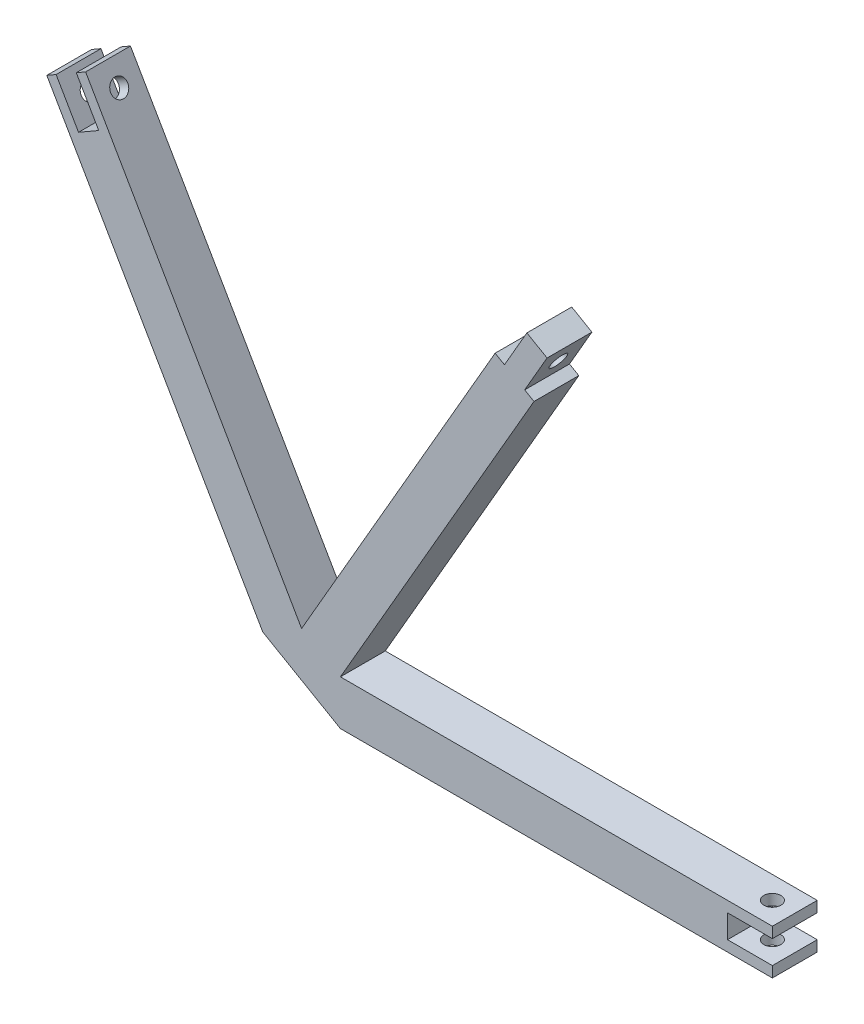
ISO-10303-21;
HEADER;
FILE_DESCRIPTION(('STEP AP214'),'2;1');
FILE_NAME('part.step','',(''),(''),'','','');
FILE_SCHEMA(('AUTOMOTIVE_DESIGN { 1 0 10303 214 1 1 1 1 }'));
ENDSEC;
DATA;
#1=APPLICATION_CONTEXT('core data for automotive mechanical design processes');
#2=APPLICATION_PROTOCOL_DEFINITION('international standard','automotive_design',2000,#1);
#3=PRODUCT_CONTEXT('',#1,'mechanical');
#4=PRODUCT('Part','Part','',(#3));
#5=PRODUCT_RELATED_PRODUCT_CATEGORY('part','',(#4));
#6=PRODUCT_DEFINITION_FORMATION('','',#4);
#7=PRODUCT_DEFINITION_CONTEXT('part definition',#1,'design');
#8=PRODUCT_DEFINITION('design','',#6,#7);
#9=PRODUCT_DEFINITION_SHAPE('','',#8);
#10=(LENGTH_UNIT() NAMED_UNIT(*) SI_UNIT(.MILLI.,.METRE.));
#11=(NAMED_UNIT(*) PLANE_ANGLE_UNIT() SI_UNIT($,.RADIAN.));
#12=(NAMED_UNIT(*) SI_UNIT($,.STERADIAN.) SOLID_ANGLE_UNIT());
#13=UNCERTAINTY_MEASURE_WITH_UNIT(LENGTH_MEASURE(1.E-05),#10,'distance_accuracy_value','');
#14=(GEOMETRIC_REPRESENTATION_CONTEXT(3) GLOBAL_UNCERTAINTY_ASSIGNED_CONTEXT((#13)) GLOBAL_UNIT_ASSIGNED_CONTEXT((#10,
#11,#12)) REPRESENTATION_CONTEXT('',''));
#15=CARTESIAN_POINT('',(0.,0.,0.));
#16=DIRECTION('',(0.,0.,1.));
#17=DIRECTION('',(1.,0.,0.));
#18=AXIS2_PLACEMENT_3D('',#15,#16,#17);
#19=CARTESIAN_POINT('',(-74.0849364905391,46.7163336986829,-2.5));
#20=DIRECTION('',(-0.500000000000004,0.866025403784436,0.));
#21=DIRECTION('',(0.,0.,-1.));
#22=AXIS2_PLACEMENT_3D('',#19,#20,#21);
#23=PLANE('',#22);
#24=DIRECTION('',(0.,0.,-1.));
#25=VECTOR('',#24,1.);
#26=CARTESIAN_POINT('',(-75.1241669750805,46.1163336986829,-2.5));
#27=LINE('',#26,#25);
#28=CARTESIAN_POINT('',(-75.1241669750805,46.1163336986829,2.5));
#29=VERTEX_POINT('',#28);
#30=CARTESIAN_POINT('',(-75.1241669750805,46.1163336986829,-2.5));
#31=VERTEX_POINT('',#30);
#32=EDGE_CURVE('E92',#29,#31,#27,.T.);
#33=ORIENTED_EDGE('',*,*,#32,.F.);
#34=DIRECTION('',(-0.866025403784436,-0.500000000000004,0.));
#35=VECTOR('',#34,1.);
#36=CARTESIAN_POINT('',(-74.0849364905391,46.7163336986829,2.5));
#37=LINE('',#36,#35);
#38=CARTESIAN_POINT('',(-74.0849364905391,46.7163336986829,2.5));
#39=VERTEX_POINT('',#38);
#40=EDGE_CURVE('E12',#39,#29,#37,.T.);
#41=ORIENTED_EDGE('',*,*,#40,.F.);
#42=DIRECTION('',(0.,0.,-1.));
#43=VECTOR('',#42,1.);
#44=CARTESIAN_POINT('',(-74.0849364905391,46.7163336986829,-2.5));
#45=LINE('',#44,#43);
#46=CARTESIAN_POINT('',(-74.0849364905391,46.7163336986829,-2.5));
#47=VERTEX_POINT('',#46);
#48=EDGE_CURVE('E103',#39,#47,#45,.T.);
#49=ORIENTED_EDGE('',*,*,#48,.T.);
#50=DIRECTION('',(-0.866025403784436,-0.500000000000004,0.));
#51=VECTOR('',#50,1.);
#52=CARTESIAN_POINT('',(-74.0849364905391,46.7163336986829,-2.5));
#53=LINE('',#52,#51);
#54=EDGE_CURVE('E53',#47,#31,#53,.T.);
#55=ORIENTED_EDGE('',*,*,#54,.T.);
#56=EDGE_LOOP('',(#33,#41,#49,#55));
#57=FACE_BOUND('',#56,.T.);
#58=ADVANCED_FACE('F50',(#57),#23,.T.);
#59=CARTESIAN_POINT('',(-71.5849364905391,42.3862066797607,2.5));
#60=DIRECTION('',(0.,0.,1.));
#61=DIRECTION('',(-0.500000000000004,0.866025403784436,0.));
#62=AXIS2_PLACEMENT_3D('',#59,#60,#61);
#63=PLANE('',#62);
#64=DIRECTION('',(-0.500000000000004,0.866025403784436,0.));
#65=VECTOR('',#64,1.);
#66=CARTESIAN_POINT('',(-72.6241669750804,41.7862066797607,2.5));
#67=LINE('',#66,#65);
#68=CARTESIAN_POINT('',(-72.6241669750804,41.7862066797607,2.5));
#69=VERTEX_POINT('',#68);
#70=EDGE_CURVE('E87',#69,#29,#67,.T.);
#71=ORIENTED_EDGE('',*,*,#70,.F.);
#72=DIRECTION('',(-0.866025403784436,-0.500000000000004,0.));
#73=VECTOR('',#72,1.);
#74=CARTESIAN_POINT('',(-75.9150635094613,39.8862066797607,2.5));
#75=LINE('',#74,#73);
#76=CARTESIAN_POINT('',(-74.87583302492,40.4862066797607,2.5));
#77=VERTEX_POINT('',#76);
#78=EDGE_CURVE('E80',#69,#77,#75,.T.);
#79=ORIENTED_EDGE('',*,*,#78,.T.);
#80=DIRECTION('',(-0.500000000000004,0.866025403784436,0.));
#81=VECTOR('',#80,1.);
#82=CARTESIAN_POINT('',(-74.87583302492,40.4862066797607,2.5));
#83=LINE('',#82,#81);
#84=CARTESIAN_POINT('',(-77.37583302492,44.8163336986829,2.5));
#85=VERTEX_POINT('',#84);
#86=EDGE_CURVE('E134',#77,#85,#83,.T.);
#87=ORIENTED_EDGE('',*,*,#86,.T.);
#88=DIRECTION('',(0.866025403784436,0.500000000000004,0.));
#89=VECTOR('',#88,1.);
#90=CARTESIAN_POINT('',(-78.4150635094613,44.2163336986829,2.5));
#91=LINE('',#90,#89);
#92=CARTESIAN_POINT('',(-78.4150635094613,44.2163336986829,2.5));
#93=VERTEX_POINT('',#92);
#94=EDGE_CURVE('E129',#93,#85,#91,.T.);
#95=ORIENTED_EDGE('',*,*,#94,.F.);
#96=DIRECTION('',(-0.500000000000004,0.866025403784436,0.));
#97=VECTOR('',#96,1.);
#98=CARTESIAN_POINT('',(-75.9150635094613,39.8862066797607,2.5));
#99=LINE('',#98,#97);
#100=CARTESIAN_POINT('',(-54.3301270189222,2.49999999999998,2.5));
#101=VERTEX_POINT('',#100);
#102=EDGE_CURVE('E133',#101,#93,#99,.T.);
#103=ORIENTED_EDGE('',*,*,#102,.F.);
#104=DIRECTION('',(0.866025403784442,-0.499999999999995,0.));
#105=VECTOR('',#104,1.);
#106=CARTESIAN_POINT('',(-87.5000000000001,21.6506350946107,2.5));
#107=LINE('',#106,#105);
#108=CARTESIAN_POINT('',(-45.6698729810778,-2.5,2.5));
#109=VERTEX_POINT('',#108);
#110=EDGE_CURVE('E178',#101,#109,#107,.T.);
#111=ORIENTED_EDGE('',*,*,#110,.T.);
#112=DIRECTION('',(1.,0.,0.));
#113=VECTOR('',#112,1.);
#114=CARTESIAN_POINT('',(-2.5,-2.5,2.5));
#115=LINE('',#114,#113);
#116=CARTESIAN_POINT('',(2.5,-2.5,2.5));
#117=VERTEX_POINT('',#116);
#118=EDGE_CURVE('E281',#109,#117,#115,.T.);
#119=ORIENTED_EDGE('',*,*,#118,.T.);
#120=DIRECTION('',(0.,1.,0.));
#121=VECTOR('',#120,1.);
#122=CARTESIAN_POINT('',(2.5,-2.5,2.5));
#123=LINE('',#122,#121);
#124=CARTESIAN_POINT('',(2.5,-1.3,2.5));
#125=VERTEX_POINT('',#124);
#126=EDGE_CURVE('E276',#117,#125,#123,.T.);
#127=ORIENTED_EDGE('',*,*,#126,.T.);
#128=DIRECTION('',(1.,0.,0.));
#129=VECTOR('',#128,1.);
#130=CARTESIAN_POINT('',(-2.5,-1.3,2.5));
#131=LINE('',#130,#129);
#132=CARTESIAN_POINT('',(-2.5,-1.3,2.5));
#133=VERTEX_POINT('',#132);
#134=EDGE_CURVE('E285',#133,#125,#131,.T.);
#135=ORIENTED_EDGE('',*,*,#134,.F.);
#136=DIRECTION('',(0.,1.,0.));
#137=VECTOR('',#136,1.);
#138=CARTESIAN_POINT('',(-2.5,2.5,2.5));
#139=LINE('',#138,#137);
#140=CARTESIAN_POINT('',(-2.5,1.3,2.5));
#141=VERTEX_POINT('',#140);
#142=EDGE_CURVE('E361',#133,#141,#139,.T.);
#143=ORIENTED_EDGE('',*,*,#142,.T.);
#144=DIRECTION('',(1.,0.,0.));
#145=VECTOR('',#144,1.);
#146=CARTESIAN_POINT('',(-2.5,1.3,2.5));
#147=LINE('',#146,#145);
#148=CARTESIAN_POINT('',(2.5,1.3,2.5));
#149=VERTEX_POINT('',#148);
#150=EDGE_CURVE('E329',#141,#149,#147,.T.);
#151=ORIENTED_EDGE('',*,*,#150,.T.);
#152=DIRECTION('',(0.,-1.,0.));
#153=VECTOR('',#152,1.);
#154=CARTESIAN_POINT('',(2.5,2.5,2.5));
#155=LINE('',#154,#153);
#156=CARTESIAN_POINT('',(2.5,2.5,2.5));
#157=VERTEX_POINT('',#156);
#158=EDGE_CURVE('E324',#157,#149,#155,.T.);
#159=ORIENTED_EDGE('',*,*,#158,.F.);
#160=DIRECTION('',(1.,0.,0.));
#161=VECTOR('',#160,1.);
#162=CARTESIAN_POINT('',(-2.5,2.5,2.5));
#163=LINE('',#162,#161);
#164=CARTESIAN_POINT('',(-45.6698729810778,2.5,2.5));
#165=VERTEX_POINT('',#164);
#166=EDGE_CURVE('E328',#165,#157,#163,.T.);
#167=ORIENTED_EDGE('',*,*,#166,.F.);
#168=DIRECTION('',(0.499999999999998,0.86602540378444,0.));
#169=VECTOR('',#168,1.);
#170=CARTESIAN_POINT('',(-47.8349364905389,-1.24999999999999,2.5));
#171=LINE('',#170,#169);
#172=CARTESIAN_POINT('',(-24.084936490539,39.8862066797609,2.5));
#173=VERTEX_POINT('',#172);
#174=EDGE_CURVE('E242',#165,#173,#171,.T.);
#175=ORIENTED_EDGE('',*,*,#174,.T.);
#176=DIRECTION('',(-0.86602540378444,0.499999999999998,0.));
#177=VECTOR('',#176,1.);
#178=CARTESIAN_POINT('',(-28.4150635094612,42.3862066797609,2.5));
#179=LINE('',#178,#177);
#180=CARTESIAN_POINT('',(-25.1241669750803,40.4862066797609,2.5));
#181=VERTEX_POINT('',#180);
#182=EDGE_CURVE('E258',#173,#181,#179,.T.);
#183=ORIENTED_EDGE('',*,*,#182,.T.);
#184=DIRECTION('',(0.499999999999998,0.86602540378444,0.));
#185=VECTOR('',#184,1.);
#186=CARTESIAN_POINT('',(-25.1241669750803,40.4862066797609,2.5));
#187=LINE('',#186,#185);
#188=CARTESIAN_POINT('',(-22.6241669750803,44.8163336986831,2.5));
#189=VERTEX_POINT('',#188);
#190=EDGE_CURVE('E199',#181,#189,#187,.T.);
#191=ORIENTED_EDGE('',*,*,#190,.T.);
#192=DIRECTION('',(0.86602540378444,-0.499999999999998,0.));
#193=VECTOR('',#192,1.);
#194=CARTESIAN_POINT('',(-24.8758330249199,46.1163336986831,2.5));
#195=LINE('',#194,#193);
#196=CARTESIAN_POINT('',(-24.8758330249199,46.1163336986831,2.5));
#197=VERTEX_POINT('',#196);
#198=EDGE_CURVE('E194',#197,#189,#195,.T.);
#199=ORIENTED_EDGE('',*,*,#198,.F.);
#200=DIRECTION('',(0.499999999999998,0.86602540378444,0.));
#201=VECTOR('',#200,1.);
#202=CARTESIAN_POINT('',(-27.3758330249199,41.7862066797609,2.5));
#203=LINE('',#202,#201);
#204=CARTESIAN_POINT('',(-27.3758330249199,41.7862066797609,2.5));
#205=VERTEX_POINT('',#204);
#206=EDGE_CURVE('E198',#205,#197,#203,.T.);
#207=ORIENTED_EDGE('',*,*,#206,.F.);
#208=CARTESIAN_POINT('',(-28.4150635094612,42.3862066797609,2.5));
#209=VERTEX_POINT('',#208);
#210=EDGE_CURVE('E262',#205,#209,#179,.T.);
#211=ORIENTED_EDGE('',*,*,#210,.T.);
#212=DIRECTION('',(0.499999999999998,0.86602540378444,0.));
#213=VECTOR('',#212,1.);
#214=CARTESIAN_POINT('',(-52.1650635094611,1.24999999999999,2.5));
#215=LINE('',#214,#213);
#216=CARTESIAN_POINT('',(-50.,5.,2.5));
#217=VERTEX_POINT('',#216);
#218=EDGE_CURVE('E246',#217,#209,#215,.T.);
#219=ORIENTED_EDGE('',*,*,#218,.F.);
#220=DIRECTION('',(-0.500000000000004,0.866025403784436,0.));
#221=VECTOR('',#220,1.);
#222=CARTESIAN_POINT('',(-71.5849364905391,42.3862066797607,2.5));
#223=LINE('',#222,#221);
#224=EDGE_CURVE('E90',#217,#39,#223,.T.);
#225=ORIENTED_EDGE('',*,*,#224,.T.);
#226=ORIENTED_EDGE('',*,*,#40,.T.);
#227=EDGE_LOOP('',(#71,#79,#87,#95,#103,#111,#119,#127,#135,#143,#151,#159,#167,#175,#183,#191,
#199,#207,#211,#219,#225,#226));
#228=FACE_BOUND('',#227,.T.);
#229=ADVANCED_FACE('F85',(#228),#63,.T.);
#230=CARTESIAN_POINT('',(-71.5849364905391,42.3862066797607,-2.5));
#231=DIRECTION('',(0.,0.,-1.));
#232=DIRECTION('',(0.500000000000004,-0.866025403784436,0.));
#233=AXIS2_PLACEMENT_3D('',#230,#231,#232);
#234=PLANE('',#233);
#235=DIRECTION('',(0.500000000000004,-0.866025403784436,0.));
#236=VECTOR('',#235,1.);
#237=CARTESIAN_POINT('',(-72.6241669750804,41.7862066797607,-2.5));
#238=LINE('',#237,#236);
#239=CARTESIAN_POINT('',(-72.6241669750804,41.7862066797607,-2.5));
#240=VERTEX_POINT('',#239);
#241=EDGE_CURVE('E97',#31,#240,#238,.T.);
#242=ORIENTED_EDGE('',*,*,#241,.F.);
#243=ORIENTED_EDGE('',*,*,#54,.F.);
#244=DIRECTION('',(0.500000000000004,-0.866025403784436,0.));
#245=VECTOR('',#244,1.);
#246=CARTESIAN_POINT('',(-71.5849364905391,42.3862066797607,-2.5));
#247=LINE('',#246,#245);
#248=CARTESIAN_POINT('',(-50.,5.,-2.5));
#249=VERTEX_POINT('',#248);
#250=EDGE_CURVE('E107',#47,#249,#247,.T.);
#251=ORIENTED_EDGE('',*,*,#250,.T.);
#252=DIRECTION('',(0.499999999999998,0.86602540378444,0.));
#253=VECTOR('',#252,1.);
#254=CARTESIAN_POINT('',(-52.1650635094611,1.24999999999999,-2.5));
#255=LINE('',#254,#253);
#256=CARTESIAN_POINT('',(-28.4150635094612,42.3862066797609,-2.5));
#257=VERTEX_POINT('',#256);
#258=EDGE_CURVE('E250',#249,#257,#255,.T.);
#259=ORIENTED_EDGE('',*,*,#258,.T.);
#260=DIRECTION('',(0.86602540378444,-0.499999999999998,0.));
#261=VECTOR('',#260,1.);
#262=CARTESIAN_POINT('',(-28.4150635094612,42.3862066797609,-2.5));
#263=LINE('',#262,#261);
#264=CARTESIAN_POINT('',(-27.3758330249199,41.7862066797609,-2.5));
#265=VERTEX_POINT('',#264);
#266=EDGE_CURVE('E267',#257,#265,#263,.T.);
#267=ORIENTED_EDGE('',*,*,#266,.T.);
#268=DIRECTION('',(-0.499999999999998,-0.86602540378444,0.));
#269=VECTOR('',#268,1.);
#270=CARTESIAN_POINT('',(-27.3758330249199,41.7862066797609,-2.5));
#271=LINE('',#270,#269);
#272=CARTESIAN_POINT('',(-24.8758330249199,46.1163336986831,-2.5));
#273=VERTEX_POINT('',#272);
#274=EDGE_CURVE('E224',#273,#265,#271,.T.);
#275=ORIENTED_EDGE('',*,*,#274,.F.);
#276=DIRECTION('',(0.86602540378444,-0.499999999999998,0.));
#277=VECTOR('',#276,1.);
#278=CARTESIAN_POINT('',(-24.8758330249199,46.1163336986831,-2.5));
#279=LINE('',#278,#277);
#280=CARTESIAN_POINT('',(-22.6241669750803,44.8163336986831,-2.5));
#281=VERTEX_POINT('',#280);
#282=EDGE_CURVE('E187',#273,#281,#279,.T.);
#283=ORIENTED_EDGE('',*,*,#282,.T.);
#284=DIRECTION('',(-0.499999999999998,-0.86602540378444,0.));
#285=VECTOR('',#284,1.);
#286=CARTESIAN_POINT('',(-25.1241669750803,40.4862066797609,-2.5));
#287=LINE('',#286,#285);
#288=CARTESIAN_POINT('',(-25.1241669750803,40.4862066797609,-2.5));
#289=VERTEX_POINT('',#288);
#290=EDGE_CURVE('E208',#281,#289,#287,.T.);
#291=ORIENTED_EDGE('',*,*,#290,.T.);
#292=CARTESIAN_POINT('',(-24.084936490539,39.8862066797609,-2.5));
#293=VERTEX_POINT('',#292);
#294=EDGE_CURVE('E271',#289,#293,#263,.T.);
#295=ORIENTED_EDGE('',*,*,#294,.T.);
#296=DIRECTION('',(0.499999999999998,0.86602540378444,0.));
#297=VECTOR('',#296,1.);
#298=CARTESIAN_POINT('',(-47.8349364905389,-1.24999999999999,-2.5));
#299=LINE('',#298,#297);
#300=CARTESIAN_POINT('',(-45.6698729810778,2.50000000000002,-2.5));
#301=VERTEX_POINT('',#300);
#302=EDGE_CURVE('E235',#301,#293,#299,.T.);
#303=ORIENTED_EDGE('',*,*,#302,.F.);
#304=DIRECTION('',(-1.,0.,0.));
#305=VECTOR('',#304,1.);
#306=CARTESIAN_POINT('',(-2.5,2.5,-2.5));
#307=LINE('',#306,#305);
#308=CARTESIAN_POINT('',(2.5,2.5,-2.5));
#309=VERTEX_POINT('',#308);
#310=EDGE_CURVE('E350',#309,#301,#307,.T.);
#311=ORIENTED_EDGE('',*,*,#310,.F.);
#312=DIRECTION('',(0.,-1.,0.));
#313=VECTOR('',#312,1.);
#314=CARTESIAN_POINT('',(2.5,2.5,-2.5));
#315=LINE('',#314,#313);
#316=CARTESIAN_POINT('',(2.5,1.3,-2.5));
#317=VERTEX_POINT('',#316);
#318=EDGE_CURVE('E317',#309,#317,#315,.T.);
#319=ORIENTED_EDGE('',*,*,#318,.T.);
#320=DIRECTION('',(-1.,0.,0.));
#321=VECTOR('',#320,1.);
#322=CARTESIAN_POINT('',(-2.5,1.3,-2.5));
#323=LINE('',#322,#321);
#324=CARTESIAN_POINT('',(-2.5,1.3,-2.5));
#325=VERTEX_POINT('',#324);
#326=EDGE_CURVE('E338',#317,#325,#323,.T.);
#327=ORIENTED_EDGE('',*,*,#326,.T.);
#328=DIRECTION('',(0.,-1.,0.));
#329=VECTOR('',#328,1.);
#330=CARTESIAN_POINT('',(-2.5,2.5,-2.5));
#331=LINE('',#330,#329);
#332=CARTESIAN_POINT('',(-2.5,-1.3,-2.5));
#333=VERTEX_POINT('',#332);
#334=EDGE_CURVE('E368',#325,#333,#331,.T.);
#335=ORIENTED_EDGE('',*,*,#334,.T.);
#336=DIRECTION('',(-1.,0.,0.));
#337=VECTOR('',#336,1.);
#338=CARTESIAN_POINT('',(-2.5,-1.3,-2.5));
#339=LINE('',#338,#337);
#340=CARTESIAN_POINT('',(2.5,-1.3,-2.5));
#341=VERTEX_POINT('',#340);
#342=EDGE_CURVE('E294',#341,#333,#339,.T.);
#343=ORIENTED_EDGE('',*,*,#342,.F.);
#344=DIRECTION('',(0.,1.,0.));
#345=VECTOR('',#344,1.);
#346=CARTESIAN_POINT('',(2.5,-2.5,-2.5));
#347=LINE('',#346,#345);
#348=CARTESIAN_POINT('',(2.5,-2.5,-2.5));
#349=VERTEX_POINT('',#348);
#350=EDGE_CURVE('E277',#349,#341,#347,.T.);
#351=ORIENTED_EDGE('',*,*,#350,.F.);
#352=DIRECTION('',(-1.,0.,0.));
#353=VECTOR('',#352,1.);
#354=CARTESIAN_POINT('',(-2.5,-2.5,-2.5));
#355=LINE('',#354,#353);
#356=CARTESIAN_POINT('',(-45.6698729810778,-2.5,-2.5));
#357=VERTEX_POINT('',#356);
#358=EDGE_CURVE('E306',#349,#357,#355,.T.);
#359=ORIENTED_EDGE('',*,*,#358,.T.);
#360=DIRECTION('',(-0.866025403784442,0.499999999999995,0.));
#361=VECTOR('',#360,1.);
#362=CARTESIAN_POINT('',(-87.5000000000001,21.6506350946107,-2.5));
#363=LINE('',#362,#361);
#364=CARTESIAN_POINT('',(-54.3301270189222,2.49999999999998,-2.5));
#365=VERTEX_POINT('',#364);
#366=EDGE_CURVE('E183',#357,#365,#363,.T.);
#367=ORIENTED_EDGE('',*,*,#366,.T.);
#368=DIRECTION('',(0.500000000000004,-0.866025403784436,0.));
#369=VECTOR('',#368,1.);
#370=CARTESIAN_POINT('',(-75.9150635094613,39.8862066797607,-2.5));
#371=LINE('',#370,#369);
#372=CARTESIAN_POINT('',(-78.4150635094613,44.2163336986829,-2.5));
#373=VERTEX_POINT('',#372);
#374=EDGE_CURVE('E154',#373,#365,#371,.T.);
#375=ORIENTED_EDGE('',*,*,#374,.F.);
#376=DIRECTION('',(0.866025403784436,0.500000000000004,0.));
#377=VECTOR('',#376,1.);
#378=CARTESIAN_POINT('',(-78.4150635094613,44.2163336986829,-2.5));
#379=LINE('',#378,#377);
#380=CARTESIAN_POINT('',(-77.37583302492,44.8163336986829,-2.5));
#381=VERTEX_POINT('',#380);
#382=EDGE_CURVE('E122',#373,#381,#379,.T.);
#383=ORIENTED_EDGE('',*,*,#382,.T.);
#384=DIRECTION('',(0.500000000000004,-0.866025403784436,0.));
#385=VECTOR('',#384,1.);
#386=CARTESIAN_POINT('',(-74.87583302492,40.4862066797607,-2.5));
#387=LINE('',#386,#385);
#388=CARTESIAN_POINT('',(-74.87583302492,40.4862066797607,-2.5));
#389=VERTEX_POINT('',#388);
#390=EDGE_CURVE('E142',#381,#389,#387,.T.);
#391=ORIENTED_EDGE('',*,*,#390,.T.);
#392=DIRECTION('',(0.866025403784436,0.500000000000004,0.));
#393=VECTOR('',#392,1.);
#394=CARTESIAN_POINT('',(-75.9150635094613,39.8862066797607,-2.5));
#395=LINE('',#394,#393);
#396=EDGE_CURVE('E170',#389,#240,#395,.T.);
#397=ORIENTED_EDGE('',*,*,#396,.T.);
#398=EDGE_LOOP('',(#242,#243,#251,#259,#267,#275,#283,#291,#295,#303,#311,#319,#327,#335,#343,
#351,#359,#367,#375,#383,#391,#397));
#399=FACE_BOUND('',#398,.T.);
#400=ADVANCED_FACE('F481',(#399),#234,.T.);
#401=CARTESIAN_POINT('',(-72.8349364905391,44.5512701892218,0.));
#402=DIRECTION('',(-0.866025403784436,-0.500000000000004,0.));
#403=DIRECTION('',(0.,0.,1.));
#404=AXIS2_PLACEMENT_3D('',#401,#402,#403);
#405=PLANE('',#404);
#406=CARTESIAN_POINT('',(-72.8349364905391,44.5512701892218,0.));
#407=DIRECTION('',(-0.866025403784436,-0.500000000000004,0.));
#408=DIRECTION('',(0.,0.,1.));
#409=AXIS2_PLACEMENT_3D('',#406,#407,#408);
#410=CIRCLE('',#409,0.95);
#411=CARTESIAN_POINT('',(-72.8349364905391,44.5512701892218,0.95));
#412=VERTEX_POINT('',#411);
#413=EDGE_CURVE('E98',#412,#412,#410,.T.);
#414=ORIENTED_EDGE('',*,*,#413,.T.);
#415=EDGE_LOOP('',(#414));
#416=FACE_BOUND('',#415,.T.);
#417=ORIENTED_EDGE('',*,*,#48,.F.);
#418=ORIENTED_EDGE('',*,*,#224,.F.);
#419=DIRECTION('',(0.,0.,-1.));
#420=VECTOR('',#419,1.);
#421=CARTESIAN_POINT('',(-50.,5.,7.5));
#422=LINE('',#421,#420);
#423=EDGE_CURVE('E174',#217,#249,#422,.T.);
#424=ORIENTED_EDGE('',*,*,#423,.T.);
#425=ORIENTED_EDGE('',*,*,#250,.F.);
#426=EDGE_LOOP('',(#417,#418,#424,#425));
#427=FACE_BOUND('',#426,.T.);
#428=ADVANCED_FACE('F556',(#416,#427),#405,.F.);
#429=CARTESIAN_POINT('',(-73.8741669750804,43.9512701892218,0.));
#430=DIRECTION('',(-0.866025403784436,-0.500000000000004,0.));
#431=DIRECTION('',(0.,0.,1.));
#432=AXIS2_PLACEMENT_3D('',#429,#430,#431);
#433=PLANE('',#432);
#434=CARTESIAN_POINT('',(-73.8741669750804,43.9512701892218,0.));
#435=DIRECTION('',(-0.866025403784436,-0.500000000000004,0.));
#436=DIRECTION('',(0.,0.,1.));
#437=AXIS2_PLACEMENT_3D('',#434,#435,#436);
#438=CIRCLE('',#437,0.95);
#439=CARTESIAN_POINT('',(-73.8741669750804,43.9512701892218,0.95));
#440=VERTEX_POINT('',#439);
#441=EDGE_CURVE('E118',#440,#440,#438,.T.);
#442=ORIENTED_EDGE('',*,*,#441,.F.);
#443=EDGE_LOOP('',(#442));
#444=FACE_BOUND('',#443,.T.);
#445=ORIENTED_EDGE('',*,*,#32,.T.);
#446=ORIENTED_EDGE('',*,*,#241,.T.);
#447=DIRECTION('',(0.,0.,1.));
#448=VECTOR('',#447,1.);
#449=CARTESIAN_POINT('',(-72.6241669750804,41.7862066797607,-2.5));
#450=LINE('',#449,#448);
#451=EDGE_CURVE('E101',#240,#69,#450,.T.);
#452=ORIENTED_EDGE('',*,*,#451,.T.);
#453=ORIENTED_EDGE('',*,*,#70,.T.);
#454=EDGE_LOOP('',(#445,#446,#452,#453));
#455=FACE_BOUND('',#454,.T.);
#456=ADVANCED_FACE('F100',(#444,#455),#433,.T.);
#457=CARTESIAN_POINT('',(-72.8349364905391,44.5512701892218,0.));
#458=DIRECTION('',(-0.866025403784436,-0.500000000000004,0.));
#459=DIRECTION('',(0.,0.,1.));
#460=AXIS2_PLACEMENT_3D('',#457,#458,#459);
#461=CYLINDRICAL_SURFACE('',#460,0.95);
#462=ORIENTED_EDGE('',*,*,#413,.F.);
#463=EDGE_LOOP('',(#462));
#464=FACE_BOUND('',#463,.T.);
#465=ORIENTED_EDGE('',*,*,#441,.T.);
#466=EDGE_LOOP('',(#465));
#467=FACE_BOUND('',#466,.T.);
#468=ADVANCED_FACE('F564',(#464,#467),#461,.F.);
#469=CARTESIAN_POINT('',(-77.1650635094613,42.0512701892218,0.));
#470=DIRECTION('',(-0.866025403784436,-0.500000000000004,0.));
#471=DIRECTION('',(0.,0.,1.));
#472=AXIS2_PLACEMENT_3D('',#469,#470,#471);
#473=PLANE('',#472);
#474=DIRECTION('',(0.,0.,-1.));
#475=VECTOR('',#474,1.);
#476=CARTESIAN_POINT('',(-78.4150635094613,44.2163336986829,-2.5));
#477=LINE('',#476,#475);
#478=EDGE_CURVE('E138',#93,#373,#477,.T.);
#479=ORIENTED_EDGE('',*,*,#478,.T.);
#480=ORIENTED_EDGE('',*,*,#374,.T.);
#481=DIRECTION('',(0.,0.,-1.));
#482=VECTOR('',#481,1.);
#483=CARTESIAN_POINT('',(-54.3301270189222,2.49999999999998,7.5));
#484=LINE('',#483,#482);
#485=EDGE_CURVE('E179',#101,#365,#484,.T.);
#486=ORIENTED_EDGE('',*,*,#485,.F.);
#487=ORIENTED_EDGE('',*,*,#102,.T.);
#488=EDGE_LOOP('',(#479,#480,#486,#487));
#489=FACE_BOUND('',#488,.T.);
#490=CARTESIAN_POINT('',(-77.1650635094613,42.0512701892218,0.));
#491=DIRECTION('',(-0.866025403784436,-0.500000000000004,0.));
#492=DIRECTION('',(0.,0.,1.));
#493=AXIS2_PLACEMENT_3D('',#490,#491,#492);
#494=CIRCLE('',#493,0.95);
#495=CARTESIAN_POINT('',(-77.1650635094613,42.0512701892218,0.95));
#496=VERTEX_POINT('',#495);
#497=EDGE_CURVE('E150',#496,#496,#494,.T.);
#498=ORIENTED_EDGE('',*,*,#497,.F.);
#499=EDGE_LOOP('',(#498));
#500=FACE_BOUND('',#499,.T.);
#501=ADVANCED_FACE('F494',(#489,#500),#473,.T.);
#502=CARTESIAN_POINT('',(-76.12583302492,42.6512701892218,0.));
#503=DIRECTION('',(-0.866025403784436,-0.500000000000004,0.));
#504=DIRECTION('',(0.,0.,1.));
#505=AXIS2_PLACEMENT_3D('',#502,#503,#504);
#506=PLANE('',#505);
#507=DIRECTION('',(0.,0.,-1.));
#508=VECTOR('',#507,1.);
#509=CARTESIAN_POINT('',(-77.37583302492,44.8163336986829,-2.5));
#510=LINE('',#509,#508);
#511=EDGE_CURVE('E146',#85,#381,#510,.T.);
#512=ORIENTED_EDGE('',*,*,#511,.F.);
#513=ORIENTED_EDGE('',*,*,#86,.F.);
#514=DIRECTION('',(0.,0.,1.));
#515=VECTOR('',#514,1.);
#516=CARTESIAN_POINT('',(-74.87583302492,40.4862066797607,-2.5));
#517=LINE('',#516,#515);
#518=EDGE_CURVE('E139',#389,#77,#517,.T.);
#519=ORIENTED_EDGE('',*,*,#518,.F.);
#520=ORIENTED_EDGE('',*,*,#390,.F.);
#521=EDGE_LOOP('',(#512,#513,#519,#520));
#522=FACE_BOUND('',#521,.T.);
#523=CARTESIAN_POINT('',(-76.12583302492,42.6512701892218,0.));
#524=DIRECTION('',(-0.866025403784436,-0.500000000000004,0.));
#525=DIRECTION('',(0.,0.,1.));
#526=AXIS2_PLACEMENT_3D('',#523,#524,#525);
#527=CIRCLE('',#526,0.95);
#528=CARTESIAN_POINT('',(-76.12583302492,42.6512701892218,0.95));
#529=VERTEX_POINT('',#528);
#530=EDGE_CURVE('E161',#529,#529,#527,.T.);
#531=ORIENTED_EDGE('',*,*,#530,.T.);
#532=EDGE_LOOP('',(#531));
#533=FACE_BOUND('',#532,.T.);
#534=ADVANCED_FACE('F487',(#522,#533),#506,.F.);
#535=CARTESIAN_POINT('',(-78.4150635094613,44.2163336986829,-2.5));
#536=DIRECTION('',(0.500000000000004,-0.866025403784436,0.));
#537=DIRECTION('',(0.,0.,1.));
#538=AXIS2_PLACEMENT_3D('',#535,#536,#537);
#539=PLANE('',#538);
#540=ORIENTED_EDGE('',*,*,#511,.T.);
#541=ORIENTED_EDGE('',*,*,#382,.F.);
#542=ORIENTED_EDGE('',*,*,#478,.F.);
#543=ORIENTED_EDGE('',*,*,#94,.T.);
#544=EDGE_LOOP('',(#540,#541,#542,#543));
#545=FACE_BOUND('',#544,.T.);
#546=ADVANCED_FACE('F492',(#545),#539,.F.);
#547=CARTESIAN_POINT('',(-77.1650635094613,42.0512701892218,0.));
#548=DIRECTION('',(0.866025403784436,0.500000000000004,0.));
#549=DIRECTION('',(0.,0.,-1.));
#550=AXIS2_PLACEMENT_3D('',#547,#548,#549);
#551=CYLINDRICAL_SURFACE('',#550,0.95);
#552=ORIENTED_EDGE('',*,*,#497,.T.);
#553=EDGE_LOOP('',(#552));
#554=FACE_BOUND('',#553,.T.);
#555=ORIENTED_EDGE('',*,*,#530,.F.);
#556=EDGE_LOOP('',(#555));
#557=FACE_BOUND('',#556,.T.);
#558=ADVANCED_FACE('F605',(#554,#557),#551,.F.);
#559=CARTESIAN_POINT('',(-73.7500000000002,41.1362066797607,0.));
#560=DIRECTION('',(0.500000000000004,-0.866025403784436,0.));
#561=DIRECTION('',(0.,0.,1.));
#562=AXIS2_PLACEMENT_3D('',#559,#560,#561);
#563=PLANE('',#562);
#564=ORIENTED_EDGE('',*,*,#451,.F.);
#565=ORIENTED_EDGE('',*,*,#396,.F.);
#566=ORIENTED_EDGE('',*,*,#518,.T.);
#567=ORIENTED_EDGE('',*,*,#78,.F.);
#568=EDGE_LOOP('',(#564,#565,#566,#567));
#569=FACE_BOUND('',#568,.T.);
#570=ADVANCED_FACE('F479',(#569),#563,.F.);
#571=CARTESIAN_POINT('',(-87.5000000000001,21.6506350946107,7.5));
#572=DIRECTION('',(-0.499999999999995,-0.866025403784442,0.));
#573=DIRECTION('',(0.866025403784442,-0.499999999999995,0.));
#574=AXIS2_PLACEMENT_3D('',#571,#572,#573);
#575=PLANE('',#574);
#576=ORIENTED_EDGE('',*,*,#485,.T.);
#577=ORIENTED_EDGE('',*,*,#366,.F.);
#578=DIRECTION('',(0.,0.,-1.));
#579=VECTOR('',#578,1.);
#580=CARTESIAN_POINT('',(-45.6698729810778,-2.5,7.5));
#581=LINE('',#580,#579);
#582=EDGE_CURVE('E372',#109,#357,#581,.T.);
#583=ORIENTED_EDGE('',*,*,#582,.F.);
#584=ORIENTED_EDGE('',*,*,#110,.F.);
#585=EDGE_LOOP('',(#576,#577,#583,#584));
#586=FACE_BOUND('',#585,.T.);
#587=ADVANCED_FACE('F389',(#586),#575,.T.);
#588=CARTESIAN_POINT('',(-26.1258330249199,43.951270189222,0.));
#589=DIRECTION('',(-0.86602540378444,0.499999999999998,0.));
#590=DIRECTION('',(0.,0.,1.));
#591=AXIS2_PLACEMENT_3D('',#588,#589,#590);
#592=PLANE('',#591);
#593=DIRECTION('',(0.,0.,-1.));
#594=VECTOR('',#593,1.);
#595=CARTESIAN_POINT('',(-24.8758330249199,46.1163336986831,-2.5));
#596=LINE('',#595,#594);
#597=EDGE_CURVE('E203',#197,#273,#596,.T.);
#598=ORIENTED_EDGE('',*,*,#597,.T.);
#599=ORIENTED_EDGE('',*,*,#274,.T.);
#600=DIRECTION('',(0.,0.,1.));
#601=VECTOR('',#600,1.);
#602=CARTESIAN_POINT('',(-27.3758330249199,41.7862066797609,-2.5));
#603=LINE('',#602,#601);
#604=EDGE_CURVE('E220',#265,#205,#603,.T.);
#605=ORIENTED_EDGE('',*,*,#604,.T.);
#606=ORIENTED_EDGE('',*,*,#206,.T.);
#607=EDGE_LOOP('',(#598,#599,#605,#606));
#608=FACE_BOUND('',#607,.T.);
#609=CARTESIAN_POINT('',(-26.1258330249199,43.951270189222,0.));
#610=DIRECTION('',(-0.86602540378444,0.499999999999998,0.));
#611=DIRECTION('',(0.,0.,1.));
#612=AXIS2_PLACEMENT_3D('',#609,#610,#611);
#613=CIRCLE('',#612,0.95);
#614=CARTESIAN_POINT('',(-26.1258330249199,43.951270189222,0.95));
#615=VERTEX_POINT('',#614);
#616=EDGE_CURVE('E216',#615,#615,#613,.T.);
#617=ORIENTED_EDGE('',*,*,#616,.F.);
#618=EDGE_LOOP('',(#617));
#619=FACE_BOUND('',#618,.T.);
#620=ADVANCED_FACE('F543',(#608,#619),#592,.T.);
#621=CARTESIAN_POINT('',(-23.8741669750803,42.651270189222,0.));
#622=DIRECTION('',(-0.86602540378444,0.499999999999998,0.));
#623=DIRECTION('',(0.,0.,1.));
#624=AXIS2_PLACEMENT_3D('',#621,#622,#623);
#625=PLANE('',#624);
#626=DIRECTION('',(0.,0.,-1.));
#627=VECTOR('',#626,1.);
#628=CARTESIAN_POINT('',(-22.6241669750803,44.8163336986831,-2.5));
#629=LINE('',#628,#627);
#630=EDGE_CURVE('E212',#189,#281,#629,.T.);
#631=ORIENTED_EDGE('',*,*,#630,.F.);
#632=ORIENTED_EDGE('',*,*,#190,.F.);
#633=DIRECTION('',(0.,0.,1.));
#634=VECTOR('',#633,1.);
#635=CARTESIAN_POINT('',(-25.1241669750803,40.4862066797609,-2.5));
#636=LINE('',#635,#634);
#637=EDGE_CURVE('E204',#289,#181,#636,.T.);
#638=ORIENTED_EDGE('',*,*,#637,.F.);
#639=ORIENTED_EDGE('',*,*,#290,.F.);
#640=EDGE_LOOP('',(#631,#632,#638,#639));
#641=FACE_BOUND('',#640,.T.);
#642=CARTESIAN_POINT('',(-23.8741669750803,42.651270189222,0.));
#643=DIRECTION('',(-0.86602540378444,0.499999999999998,0.));
#644=DIRECTION('',(0.,0.,1.));
#645=AXIS2_PLACEMENT_3D('',#642,#643,#644);
#646=CIRCLE('',#645,0.95);
#647=CARTESIAN_POINT('',(-23.8741669750803,42.651270189222,0.95));
#648=VERTEX_POINT('',#647);
#649=EDGE_CURVE('E231',#648,#648,#646,.T.);
#650=ORIENTED_EDGE('',*,*,#649,.T.);
#651=EDGE_LOOP('',(#650));
#652=FACE_BOUND('',#651,.T.);
#653=ADVANCED_FACE('F534',(#641,#652),#625,.F.);
#654=CARTESIAN_POINT('',(-24.8758330249199,46.1163336986831,-2.5));
#655=DIRECTION('',(-0.499999999999998,-0.86602540378444,0.));
#656=DIRECTION('',(0.,0.,1.));
#657=AXIS2_PLACEMENT_3D('',#654,#655,#656);
#658=PLANE('',#657);
#659=ORIENTED_EDGE('',*,*,#630,.T.);
#660=ORIENTED_EDGE('',*,*,#282,.F.);
#661=ORIENTED_EDGE('',*,*,#597,.F.);
#662=ORIENTED_EDGE('',*,*,#198,.T.);
#663=EDGE_LOOP('',(#659,#660,#661,#662));
#664=FACE_BOUND('',#663,.T.);
#665=ADVANCED_FACE('F540',(#664),#658,.F.);
#666=CARTESIAN_POINT('',(-26.1258330249199,43.951270189222,0.));
#667=DIRECTION('',(0.86602540378444,-0.499999999999998,0.));
#668=DIRECTION('',(0.,0.,-1.));
#669=AXIS2_PLACEMENT_3D('',#666,#667,#668);
#670=CYLINDRICAL_SURFACE('',#669,0.95);
#671=ORIENTED_EDGE('',*,*,#616,.T.);
#672=EDGE_LOOP('',(#671));
#673=FACE_BOUND('',#672,.T.);
#674=ORIENTED_EDGE('',*,*,#649,.F.);
#675=EDGE_LOOP('',(#674));
#676=FACE_BOUND('',#675,.T.);
#677=ADVANCED_FACE('F658',(#673,#676),#670,.F.);
#678=CARTESIAN_POINT('',(-26.2500000000001,41.1362066797609,0.));
#679=DIRECTION('',(-0.499999999999998,-0.86602540378444,0.));
#680=DIRECTION('',(0.,0.,1.));
#681=AXIS2_PLACEMENT_3D('',#678,#679,#680);
#682=PLANE('',#681);
#683=ORIENTED_EDGE('',*,*,#294,.F.);
#684=ORIENTED_EDGE('',*,*,#637,.T.);
#685=ORIENTED_EDGE('',*,*,#182,.F.);
#686=DIRECTION('',(0.,0.,1.));
#687=VECTOR('',#686,1.);
#688=CARTESIAN_POINT('',(-24.084936490539,39.8862066797609,-2.5));
#689=LINE('',#688,#687);
#690=EDGE_CURVE('E263',#293,#173,#689,.T.);
#691=ORIENTED_EDGE('',*,*,#690,.F.);
#692=EDGE_LOOP('',(#683,#684,#685,#691));
#693=FACE_BOUND('',#692,.T.);
#694=ADVANCED_FACE('F530',(#693),#682,.F.);
#695=CARTESIAN_POINT('',(-52.1650635094611,1.24999999999999,-2.5));
#696=DIRECTION('',(0.86602540378444,-0.499999999999998,0.));
#697=DIRECTION('',(0.,0.,-1.));
#698=AXIS2_PLACEMENT_3D('',#695,#696,#697);
#699=PLANE('',#698);
#700=ORIENTED_EDGE('',*,*,#423,.F.);
#701=ORIENTED_EDGE('',*,*,#218,.T.);
#702=DIRECTION('',(0.,0.,-1.));
#703=VECTOR('',#702,1.);
#704=CARTESIAN_POINT('',(-28.4150635094612,42.3862066797609,-2.5));
#705=LINE('',#704,#703);
#706=EDGE_CURVE('E254',#209,#257,#705,.T.);
#707=ORIENTED_EDGE('',*,*,#706,.T.);
#708=ORIENTED_EDGE('',*,*,#258,.F.);
#709=EDGE_LOOP('',(#700,#701,#707,#708));
#710=FACE_BOUND('',#709,.T.);
#711=ADVANCED_FACE('F550',(#710),#699,.F.);
#712=CARTESIAN_POINT('',(-47.8349364905389,-1.24999999999999,-2.5));
#713=DIRECTION('',(-0.86602540378444,0.499999999999998,0.));
#714=DIRECTION('',(0.,0.,1.));
#715=AXIS2_PLACEMENT_3D('',#712,#713,#714);
#716=PLANE('',#715);
#717=ORIENTED_EDGE('',*,*,#174,.F.);
#718=DIRECTION('',(0.,0.,-1.));
#719=VECTOR('',#718,1.);
#720=CARTESIAN_POINT('',(-45.6698729810778,2.50000000000002,7.5));
#721=LINE('',#720,#719);
#722=EDGE_CURVE('E272',#165,#301,#721,.T.);
#723=ORIENTED_EDGE('',*,*,#722,.T.);
#724=ORIENTED_EDGE('',*,*,#302,.T.);
#725=ORIENTED_EDGE('',*,*,#690,.T.);
#726=EDGE_LOOP('',(#717,#723,#724,#725));
#727=FACE_BOUND('',#726,.T.);
#728=ADVANCED_FACE('F527',(#727),#716,.F.);
#729=ORIENTED_EDGE('',*,*,#604,.F.);
#730=ORIENTED_EDGE('',*,*,#266,.F.);
#731=ORIENTED_EDGE('',*,*,#706,.F.);
#732=ORIENTED_EDGE('',*,*,#210,.F.);
#733=EDGE_LOOP('',(#729,#730,#731,#732));
#734=FACE_BOUND('',#733,.T.);
#735=ADVANCED_FACE('F553',(#734),#682,.F.);
#736=CARTESIAN_POINT('',(2.5,-2.5,-2.5));
#737=DIRECTION('',(1.,0.,0.));
#738=DIRECTION('',(0.,0.,-1.));
#739=AXIS2_PLACEMENT_3D('',#736,#737,#738);
#740=PLANE('',#739);
#741=DIRECTION('',(0.,0.,-1.));
#742=VECTOR('',#741,1.);
#743=CARTESIAN_POINT('',(2.5,-1.3,-2.5));
#744=LINE('',#743,#742);
#745=EDGE_CURVE('E298',#125,#341,#744,.T.);
#746=ORIENTED_EDGE('',*,*,#745,.F.);
#747=ORIENTED_EDGE('',*,*,#126,.F.);
#748=DIRECTION('',(0.,0.,-1.));
#749=VECTOR('',#748,1.);
#750=CARTESIAN_POINT('',(2.5,-2.5,-2.5));
#751=LINE('',#750,#749);
#752=EDGE_CURVE('E289',#117,#349,#751,.T.);
#753=ORIENTED_EDGE('',*,*,#752,.T.);
#754=ORIENTED_EDGE('',*,*,#350,.T.);
#755=EDGE_LOOP('',(#746,#747,#753,#754));
#756=FACE_BOUND('',#755,.T.);
#757=ADVANCED_FACE('F499',(#756),#740,.T.);
#758=CARTESIAN_POINT('',(0.,-2.5,0.));
#759=DIRECTION('',(0.,1.,0.));
#760=DIRECTION('',(0.,0.,1.));
#761=AXIS2_PLACEMENT_3D('',#758,#759,#760);
#762=PLANE('',#761);
#763=CARTESIAN_POINT('',(0.,-2.5,0.));
#764=DIRECTION('',(0.,1.,0.));
#765=DIRECTION('',(0.,0.,1.));
#766=AXIS2_PLACEMENT_3D('',#763,#764,#765);
#767=CIRCLE('',#766,0.95);
#768=CARTESIAN_POINT('',(0.,-2.5,0.95));
#769=VERTEX_POINT('',#768);
#770=EDGE_CURVE('E302',#769,#769,#767,.T.);
#771=ORIENTED_EDGE('',*,*,#770,.T.);
#772=EDGE_LOOP('',(#771));
#773=FACE_BOUND('',#772,.T.);
#774=ORIENTED_EDGE('',*,*,#752,.F.);
#775=ORIENTED_EDGE('',*,*,#118,.F.);
#776=ORIENTED_EDGE('',*,*,#582,.T.);
#777=ORIENTED_EDGE('',*,*,#358,.F.);
#778=EDGE_LOOP('',(#774,#775,#776,#777));
#779=FACE_BOUND('',#778,.T.);
#780=ADVANCED_FACE('F381',(#773,#779),#762,.F.);
#781=CARTESIAN_POINT('',(0.,-1.3,0.));
#782=DIRECTION('',(0.,1.,0.));
#783=DIRECTION('',(0.,0.,1.));
#784=AXIS2_PLACEMENT_3D('',#781,#782,#783);
#785=PLANE('',#784);
#786=CARTESIAN_POINT('',(0.,-1.3,0.));
#787=DIRECTION('',(0.,1.,0.));
#788=DIRECTION('',(0.,0.,1.));
#789=AXIS2_PLACEMENT_3D('',#786,#787,#788);
#790=CIRCLE('',#789,0.95);
#791=CARTESIAN_POINT('',(0.,-1.3,0.95));
#792=VERTEX_POINT('',#791);
#793=EDGE_CURVE('E313',#792,#792,#790,.T.);
#794=ORIENTED_EDGE('',*,*,#793,.F.);
#795=EDGE_LOOP('',(#794));
#796=FACE_BOUND('',#795,.T.);
#797=ORIENTED_EDGE('',*,*,#745,.T.);
#798=ORIENTED_EDGE('',*,*,#342,.T.);
#799=DIRECTION('',(0.,0.,1.));
#800=VECTOR('',#799,1.);
#801=CARTESIAN_POINT('',(-2.5,-1.3,-2.5));
#802=LINE('',#801,#800);
#803=EDGE_CURVE('E290',#333,#133,#802,.T.);
#804=ORIENTED_EDGE('',*,*,#803,.T.);
#805=ORIENTED_EDGE('',*,*,#134,.T.);
#806=EDGE_LOOP('',(#797,#798,#804,#805));
#807=FACE_BOUND('',#806,.T.);
#808=ADVANCED_FACE('F503',(#796,#807),#785,.T.);
#809=CARTESIAN_POINT('',(0.,-2.5,0.));
#810=DIRECTION('',(0.,1.,0.));
#811=DIRECTION('',(0.,0.,1.));
#812=AXIS2_PLACEMENT_3D('',#809,#810,#811);
#813=CYLINDRICAL_SURFACE('',#812,0.95);
#814=ORIENTED_EDGE('',*,*,#770,.F.);
#815=EDGE_LOOP('',(#814));
#816=FACE_BOUND('',#815,.T.);
#817=ORIENTED_EDGE('',*,*,#793,.T.);
#818=EDGE_LOOP('',(#817));
#819=FACE_BOUND('',#818,.T.);
#820=ADVANCED_FACE('F731',(#816,#819),#813,.F.);
#821=CARTESIAN_POINT('',(0.,2.5,0.));
#822=DIRECTION('',(0.,1.,0.));
#823=DIRECTION('',(0.,0.,1.));
#824=AXIS2_PLACEMENT_3D('',#821,#822,#823);
#825=PLANE('',#824);
#826=DIRECTION('',(0.,0.,-1.));
#827=VECTOR('',#826,1.);
#828=CARTESIAN_POINT('',(2.5,2.5,-2.5));
#829=LINE('',#828,#827);
#830=EDGE_CURVE('E333',#157,#309,#829,.T.);
#831=ORIENTED_EDGE('',*,*,#830,.T.);
#832=ORIENTED_EDGE('',*,*,#310,.T.);
#833=ORIENTED_EDGE('',*,*,#722,.F.);
#834=ORIENTED_EDGE('',*,*,#166,.T.);
#835=EDGE_LOOP('',(#831,#832,#833,#834));
#836=FACE_BOUND('',#835,.T.);
#837=CARTESIAN_POINT('',(0.,2.5,0.));
#838=DIRECTION('',(0.,1.,0.));
#839=DIRECTION('',(0.,0.,1.));
#840=AXIS2_PLACEMENT_3D('',#837,#838,#839);
#841=CIRCLE('',#840,0.95);
#842=CARTESIAN_POINT('',(0.,2.5,0.95));
#843=VERTEX_POINT('',#842);
#844=EDGE_CURVE('E346',#843,#843,#841,.T.);
#845=ORIENTED_EDGE('',*,*,#844,.F.);
#846=EDGE_LOOP('',(#845));
#847=FACE_BOUND('',#846,.T.);
#848=ADVANCED_FACE('F519',(#836,#847),#825,.T.);
#849=CARTESIAN_POINT('',(0.,1.3,0.));
#850=DIRECTION('',(0.,1.,0.));
#851=DIRECTION('',(0.,0.,1.));
#852=AXIS2_PLACEMENT_3D('',#849,#850,#851);
#853=PLANE('',#852);
#854=DIRECTION('',(0.,0.,-1.));
#855=VECTOR('',#854,1.);
#856=CARTESIAN_POINT('',(2.5,1.3,-2.5));
#857=LINE('',#856,#855);
#858=EDGE_CURVE('E342',#149,#317,#857,.T.);
#859=ORIENTED_EDGE('',*,*,#858,.F.);
#860=ORIENTED_EDGE('',*,*,#150,.F.);
#861=DIRECTION('',(0.,0.,1.));
#862=VECTOR('',#861,1.);
#863=CARTESIAN_POINT('',(-2.5,1.3,-2.5));
#864=LINE('',#863,#862);
#865=EDGE_CURVE('E334',#325,#141,#864,.T.);
#866=ORIENTED_EDGE('',*,*,#865,.F.);
#867=ORIENTED_EDGE('',*,*,#326,.F.);
#868=EDGE_LOOP('',(#859,#860,#866,#867));
#869=FACE_BOUND('',#868,.T.);
#870=CARTESIAN_POINT('',(0.,1.3,0.));
#871=DIRECTION('',(0.,1.,0.));
#872=DIRECTION('',(0.,0.,1.));
#873=AXIS2_PLACEMENT_3D('',#870,#871,#872);
#874=CIRCLE('',#873,0.95);
#875=CARTESIAN_POINT('',(0.,1.3,0.95));
#876=VERTEX_POINT('',#875);
#877=EDGE_CURVE('E357',#876,#876,#874,.T.);
#878=ORIENTED_EDGE('',*,*,#877,.T.);
#879=EDGE_LOOP('',(#878));
#880=FACE_BOUND('',#879,.T.);
#881=ADVANCED_FACE('F511',(#869,#880),#853,.F.);
#882=CARTESIAN_POINT('',(2.5,2.5,-2.5));
#883=DIRECTION('',(-1.,0.,0.));
#884=DIRECTION('',(0.,0.,1.));
#885=AXIS2_PLACEMENT_3D('',#882,#883,#884);
#886=PLANE('',#885);
#887=ORIENTED_EDGE('',*,*,#858,.T.);
#888=ORIENTED_EDGE('',*,*,#318,.F.);
#889=ORIENTED_EDGE('',*,*,#830,.F.);
#890=ORIENTED_EDGE('',*,*,#158,.T.);
#891=EDGE_LOOP('',(#887,#888,#889,#890));
#892=FACE_BOUND('',#891,.T.);
#893=ADVANCED_FACE('F517',(#892),#886,.F.);
#894=CARTESIAN_POINT('',(0.,2.5,0.));
#895=DIRECTION('',(0.,-1.,0.));
#896=DIRECTION('',(0.,0.,-1.));
#897=AXIS2_PLACEMENT_3D('',#894,#895,#896);
#898=CYLINDRICAL_SURFACE('',#897,0.95);
#899=ORIENTED_EDGE('',*,*,#844,.T.);
#900=EDGE_LOOP('',(#899));
#901=FACE_BOUND('',#900,.T.);
#902=ORIENTED_EDGE('',*,*,#877,.F.);
#903=EDGE_LOOP('',(#902));
#904=FACE_BOUND('',#903,.T.);
#905=ADVANCED_FACE('F769',(#901,#904),#898,.F.);
#906=CARTESIAN_POINT('',(-2.5,0.,0.));
#907=DIRECTION('',(-1.,0.,0.));
#908=DIRECTION('',(0.,0.,1.));
#909=AXIS2_PLACEMENT_3D('',#906,#907,#908);
#910=PLANE('',#909);
#911=ORIENTED_EDGE('',*,*,#803,.F.);
#912=ORIENTED_EDGE('',*,*,#334,.F.);
#913=ORIENTED_EDGE('',*,*,#865,.T.);
#914=ORIENTED_EDGE('',*,*,#142,.F.);
#915=EDGE_LOOP('',(#911,#912,#913,#914));
#916=FACE_BOUND('',#915,.T.);
#917=ADVANCED_FACE('F506',(#916),#910,.F.);
#918=CLOSED_SHELL('',(#58,#229,#400,#428,#456,#468,#501,#534,#546,#558,#570,#587,#620,#653,#665,
#677,#694,#711,#728,#735,#757,#780,#808,#820,#848,#881,#893,#905,#917));
#919=MANIFOLD_SOLID_BREP('B2',#918);
#920=ADVANCED_BREP_SHAPE_REPRESENTATION('',(#18,#919),#14);
#921=SHAPE_DEFINITION_REPRESENTATION(#9,#920);
ENDSEC;
END-ISO-10303-21;
